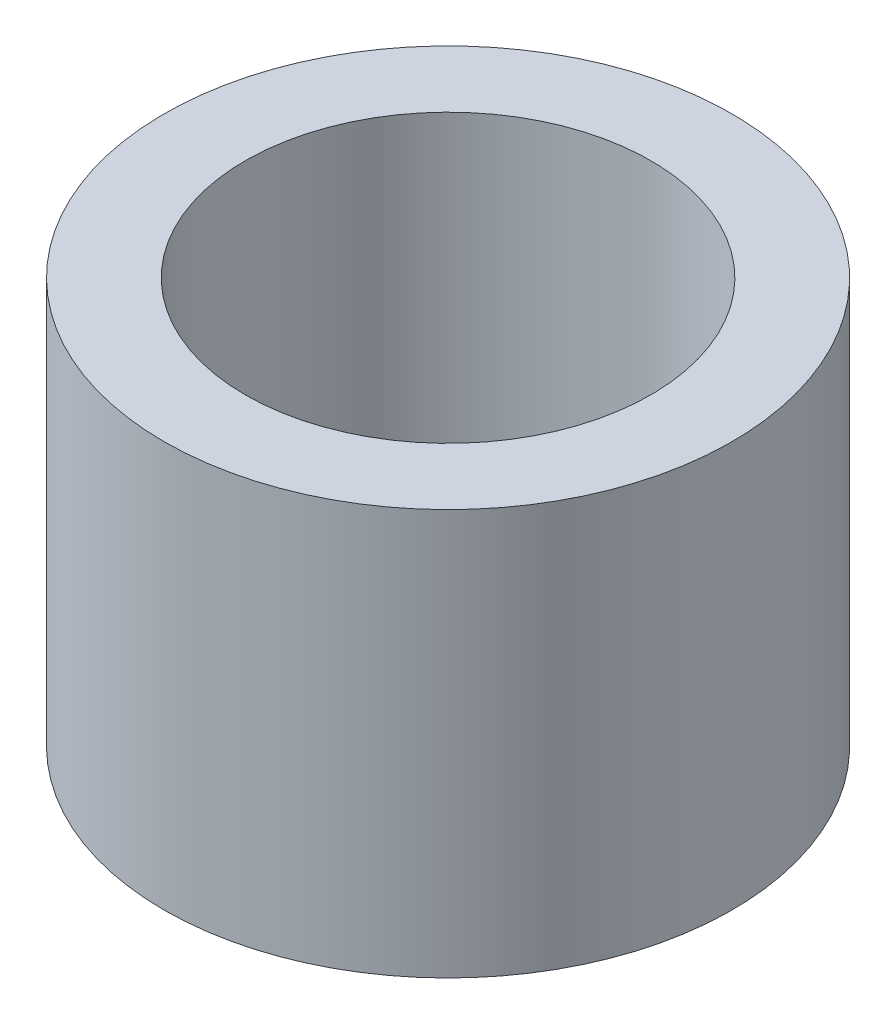
ISO-10303-21;
HEADER;
FILE_DESCRIPTION(('STEP AP214'),'2;1');
FILE_NAME('part.step','',(''),(''),'','','');
FILE_SCHEMA(('AUTOMOTIVE_DESIGN { 1 0 10303 214 1 1 1 1 }'));
ENDSEC;
DATA;
#1=APPLICATION_CONTEXT('core data for automotive mechanical design processes');
#2=APPLICATION_PROTOCOL_DEFINITION('international standard','automotive_design',2000,#1);
#3=PRODUCT_CONTEXT('',#1,'mechanical');
#4=PRODUCT('Part','Part','',(#3));
#5=PRODUCT_RELATED_PRODUCT_CATEGORY('part','',(#4));
#6=PRODUCT_DEFINITION_FORMATION('','',#4);
#7=PRODUCT_DEFINITION_CONTEXT('part definition',#1,'design');
#8=PRODUCT_DEFINITION('design','',#6,#7);
#9=PRODUCT_DEFINITION_SHAPE('','',#8);
#10=(LENGTH_UNIT() NAMED_UNIT(*) SI_UNIT(.MILLI.,.METRE.));
#11=(NAMED_UNIT(*) PLANE_ANGLE_UNIT() SI_UNIT($,.RADIAN.));
#12=(NAMED_UNIT(*) SI_UNIT($,.STERADIAN.) SOLID_ANGLE_UNIT());
#13=UNCERTAINTY_MEASURE_WITH_UNIT(LENGTH_MEASURE(1.E-05),#10,'distance_accuracy_value','');
#14=(GEOMETRIC_REPRESENTATION_CONTEXT(3) GLOBAL_UNCERTAINTY_ASSIGNED_CONTEXT((#13)) GLOBAL_UNIT_ASSIGNED_CONTEXT((#10,
#11,#12)) REPRESENTATION_CONTEXT('',''));
#15=CARTESIAN_POINT('',(0.,0.,0.));
#16=DIRECTION('',(0.,0.,1.));
#17=DIRECTION('',(1.,0.,0.));
#18=AXIS2_PLACEMENT_3D('',#15,#16,#17);
#19=CARTESIAN_POINT('',(0.,5.,0.));
#20=DIRECTION('',(0.,1.,0.));
#21=DIRECTION('',(0.,0.,1.));
#22=AXIS2_PLACEMENT_3D('',#19,#20,#21);
#23=PLANE('',#22);
#24=CARTESIAN_POINT('',(0.,5.,0.));
#25=DIRECTION('',(0.,1.,0.));
#26=DIRECTION('',(0.,0.,1.));
#27=AXIS2_PLACEMENT_3D('',#24,#25,#26);
#28=CIRCLE('',#27,3.5);
#29=CARTESIAN_POINT('',(0.,5.,3.5));
#30=VERTEX_POINT('',#29);
#31=EDGE_CURVE('E10',#30,#30,#28,.T.);
#32=ORIENTED_EDGE('',*,*,#31,.T.);
#33=EDGE_LOOP('',(#32));
#34=FACE_BOUND('',#33,.T.);
#35=CARTESIAN_POINT('',(0.,5.,0.));
#36=DIRECTION('',(0.,1.,0.));
#37=DIRECTION('',(0.,0.,1.));
#38=AXIS2_PLACEMENT_3D('',#35,#36,#37);
#39=CIRCLE('',#38,2.5);
#40=CARTESIAN_POINT('',(0.,5.,2.5));
#41=VERTEX_POINT('',#40);
#42=EDGE_CURVE('E44',#41,#41,#39,.T.);
#43=ORIENTED_EDGE('',*,*,#42,.F.);
#44=EDGE_LOOP('',(#43));
#45=FACE_BOUND('',#44,.T.);
#46=ADVANCED_FACE('F33',(#34,#45),#23,.T.);
#47=CARTESIAN_POINT('',(0.,0.,0.));
#48=DIRECTION('',(0.,1.,0.));
#49=DIRECTION('',(0.,0.,1.));
#50=AXIS2_PLACEMENT_3D('',#47,#48,#49);
#51=PLANE('',#50);
#52=CARTESIAN_POINT('',(0.,0.,0.));
#53=DIRECTION('',(0.,1.,0.));
#54=DIRECTION('',(0.,0.,1.));
#55=AXIS2_PLACEMENT_3D('',#52,#53,#54);
#56=CIRCLE('',#55,3.5);
#57=CARTESIAN_POINT('',(0.,0.,3.5));
#58=VERTEX_POINT('',#57);
#59=EDGE_CURVE('E37',#58,#58,#56,.T.);
#60=ORIENTED_EDGE('',*,*,#59,.F.);
#61=EDGE_LOOP('',(#60));
#62=FACE_BOUND('',#61,.T.);
#63=CARTESIAN_POINT('',(0.,0.,0.));
#64=DIRECTION('',(0.,1.,0.));
#65=DIRECTION('',(0.,0.,1.));
#66=AXIS2_PLACEMENT_3D('',#63,#64,#65);
#67=CIRCLE('',#66,2.5);
#68=CARTESIAN_POINT('',(0.,0.,2.5));
#69=VERTEX_POINT('',#68);
#70=EDGE_CURVE('E46',#69,#69,#67,.T.);
#71=ORIENTED_EDGE('',*,*,#70,.T.);
#72=EDGE_LOOP('',(#71));
#73=FACE_BOUND('',#72,.T.);
#74=ADVANCED_FACE('F56',(#62,#73),#51,.F.);
#75=CARTESIAN_POINT('',(0.,5.,0.));
#76=DIRECTION('',(0.,-1.,0.));
#77=DIRECTION('',(0.,0.,-1.));
#78=AXIS2_PLACEMENT_3D('',#75,#76,#77);
#79=CYLINDRICAL_SURFACE('',#78,3.5);
#80=ORIENTED_EDGE('',*,*,#31,.F.);
#81=EDGE_LOOP('',(#80));
#82=FACE_BOUND('',#81,.T.);
#83=ORIENTED_EDGE('',*,*,#59,.T.);
#84=EDGE_LOOP('',(#83));
#85=FACE_BOUND('',#84,.T.);
#86=ADVANCED_FACE('F35',(#82,#85),#79,.T.);
#87=CARTESIAN_POINT('',(0.,5.,0.));
#88=DIRECTION('',(0.,-1.,0.));
#89=DIRECTION('',(0.,0.,-1.));
#90=AXIS2_PLACEMENT_3D('',#87,#88,#89);
#91=CYLINDRICAL_SURFACE('',#90,2.5);
#92=ORIENTED_EDGE('',*,*,#42,.T.);
#93=EDGE_LOOP('',(#92));
#94=FACE_BOUND('',#93,.T.);
#95=ORIENTED_EDGE('',*,*,#70,.F.);
#96=EDGE_LOOP('',(#95));
#97=FACE_BOUND('',#96,.T.);
#98=ADVANCED_FACE('F52',(#94,#97),#91,.F.);
#99=CLOSED_SHELL('',(#46,#74,#86,#98));
#100=MANIFOLD_SOLID_BREP('B2',#99);
#101=ADVANCED_BREP_SHAPE_REPRESENTATION('',(#18,#100),#14);
#102=SHAPE_DEFINITION_REPRESENTATION(#9,#101);
ENDSEC;
END-ISO-10303-21;
